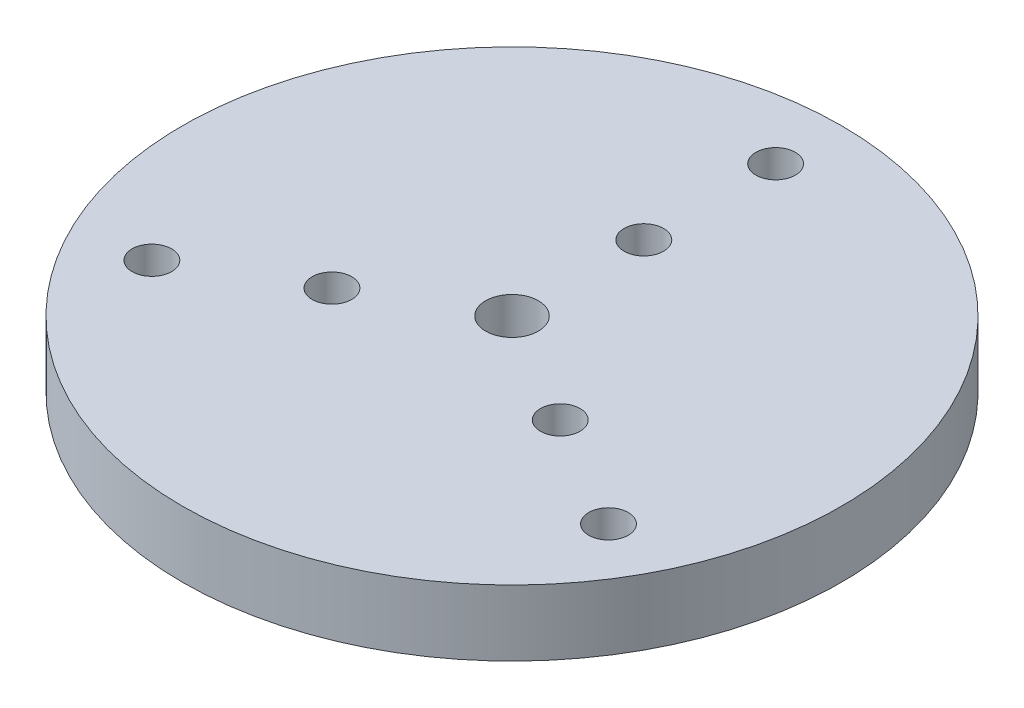
ISO-10303-21;
HEADER;
FILE_DESCRIPTION(('STEP AP214'),'2;1');
FILE_NAME('part.step','',(''),(''),'','','');
FILE_SCHEMA(('AUTOMOTIVE_DESIGN { 1 0 10303 214 1 1 1 1 }'));
ENDSEC;
DATA;
#1=APPLICATION_CONTEXT('core data for automotive mechanical design processes');
#2=APPLICATION_PROTOCOL_DEFINITION('international standard','automotive_design',2000,#1);
#3=PRODUCT_CONTEXT('',#1,'mechanical');
#4=PRODUCT('Part','Part','',(#3));
#5=PRODUCT_RELATED_PRODUCT_CATEGORY('part','',(#4));
#6=PRODUCT_DEFINITION_FORMATION('','',#4);
#7=PRODUCT_DEFINITION_CONTEXT('part definition',#1,'design');
#8=PRODUCT_DEFINITION('design','',#6,#7);
#9=PRODUCT_DEFINITION_SHAPE('','',#8);
#10=(LENGTH_UNIT() NAMED_UNIT(*) SI_UNIT(.MILLI.,.METRE.));
#11=(NAMED_UNIT(*) PLANE_ANGLE_UNIT() SI_UNIT($,.RADIAN.));
#12=(NAMED_UNIT(*) SI_UNIT($,.STERADIAN.) SOLID_ANGLE_UNIT());
#13=UNCERTAINTY_MEASURE_WITH_UNIT(LENGTH_MEASURE(1.E-05),#10,'distance_accuracy_value','');
#14=(GEOMETRIC_REPRESENTATION_CONTEXT(3) GLOBAL_UNCERTAINTY_ASSIGNED_CONTEXT((#13)) GLOBAL_UNIT_ASSIGNED_CONTEXT((#10,
#11,#12)) REPRESENTATION_CONTEXT('',''));
#15=CARTESIAN_POINT('',(0.,0.,0.));
#16=DIRECTION('',(0.,0.,1.));
#17=DIRECTION('',(1.,0.,0.));
#18=AXIS2_PLACEMENT_3D('',#15,#16,#17);
#19=CARTESIAN_POINT('',(0.,10.,0.));
#20=DIRECTION('',(0.,1.,0.));
#21=DIRECTION('',(0.,0.,1.));
#22=AXIS2_PLACEMENT_3D('',#19,#20,#21);
#23=PLANE('',#22);
#24=CARTESIAN_POINT('',(-34.6410161513746,10.,20.0000000000017));
#25=DIRECTION('',(0.,1.,0.));
#26=DIRECTION('',(0.,0.,1.));
#27=AXIS2_PLACEMENT_3D('',#24,#25,#26);
#28=CIRCLE('',#27,3.00000000000372);
#29=CARTESIAN_POINT('',(-34.6410161513746,10.,23.0000000000054));
#30=VERTEX_POINT('',#29);
#31=EDGE_CURVE('E71',#30,#30,#28,.T.);
#32=ORIENTED_EDGE('',*,*,#31,.F.);
#33=EDGE_LOOP('',(#32));
#34=FACE_BOUND('',#33,.T.);
#35=CARTESIAN_POINT('',(34.6410161513805,10.,19.9999999999983));
#36=DIRECTION('',(0.,1.,0.));
#37=DIRECTION('',(0.,0.,1.));
#38=AXIS2_PLACEMENT_3D('',#35,#36,#37);
#39=CIRCLE('',#38,3.00000000000253);
#40=CARTESIAN_POINT('',(34.6410161513805,10.,23.0000000000008));
#41=VERTEX_POINT('',#40);
#42=EDGE_CURVE('E59',#41,#41,#39,.T.);
#43=ORIENTED_EDGE('',*,*,#42,.F.);
#44=EDGE_LOOP('',(#43));
#45=FACE_BOUND('',#44,.T.);
#46=CARTESIAN_POINT('',(0.,10.,-40.));
#47=DIRECTION('',(0.,1.,0.));
#48=DIRECTION('',(0.,0.,1.));
#49=AXIS2_PLACEMENT_3D('',#46,#47,#48);
#50=CIRCLE('',#49,3.);
#51=CARTESIAN_POINT('',(0.,10.,-37.));
#52=VERTEX_POINT('',#51);
#53=EDGE_CURVE('E47',#52,#52,#50,.T.);
#54=ORIENTED_EDGE('',*,*,#53,.F.);
#55=EDGE_LOOP('',(#54));
#56=FACE_BOUND('',#55,.T.);
#57=CARTESIAN_POINT('',(0.,10.,0.));
#58=DIRECTION('',(0.,1.,0.));
#59=DIRECTION('',(0.,0.,1.));
#60=AXIS2_PLACEMENT_3D('',#57,#58,#59);
#61=CIRCLE('',#60,50.);
#62=CARTESIAN_POINT('',(0.,10.,50.));
#63=VERTEX_POINT('',#62);
#64=EDGE_CURVE('E10',#63,#63,#61,.T.);
#65=ORIENTED_EDGE('',*,*,#64,.T.);
#66=EDGE_LOOP('',(#65));
#67=FACE_BOUND('',#66,.T.);
#68=CARTESIAN_POINT('',(0.,10.,0.));
#69=DIRECTION('',(0.,1.,0.));
#70=DIRECTION('',(0.,0.,1.));
#71=AXIS2_PLACEMENT_3D('',#68,#69,#70);
#72=CIRCLE('',#71,4.);
#73=CARTESIAN_POINT('',(0.,10.,4.));
#74=VERTEX_POINT('',#73);
#75=EDGE_CURVE('E42',#74,#74,#72,.T.);
#76=ORIENTED_EDGE('',*,*,#75,.F.);
#77=EDGE_LOOP('',(#76));
#78=FACE_BOUND('',#77,.T.);
#79=CARTESIAN_POINT('',(0.,10.,-20.));
#80=DIRECTION('',(0.,1.,0.));
#81=DIRECTION('',(0.,0.,1.));
#82=AXIS2_PLACEMENT_3D('',#79,#80,#81);
#83=CIRCLE('',#82,3.);
#84=CARTESIAN_POINT('',(0.,10.,-17.));
#85=VERTEX_POINT('',#84);
#86=EDGE_CURVE('E53',#85,#85,#83,.T.);
#87=ORIENTED_EDGE('',*,*,#86,.F.);
#88=EDGE_LOOP('',(#87));
#89=FACE_BOUND('',#88,.T.);
#90=CARTESIAN_POINT('',(17.3205080756918,10.,9.99999999999828));
#91=DIRECTION('',(0.,1.,0.));
#92=DIRECTION('',(0.,0.,1.));
#93=AXIS2_PLACEMENT_3D('',#90,#91,#92);
#94=CIRCLE('',#93,3.00000000000244);
#95=CARTESIAN_POINT('',(17.3205080756918,10.,13.0000000000007));
#96=VERTEX_POINT('',#95);
#97=EDGE_CURVE('E65',#96,#96,#94,.T.);
#98=ORIENTED_EDGE('',*,*,#97,.F.);
#99=EDGE_LOOP('',(#98));
#100=FACE_BOUND('',#99,.T.);
#101=CARTESIAN_POINT('',(-17.3205080756858,10.,10.0000000000017));
#102=DIRECTION('',(0.,1.,0.));
#103=DIRECTION('',(0.,0.,1.));
#104=AXIS2_PLACEMENT_3D('',#101,#102,#103);
#105=CIRCLE('',#104,3.00000000000353);
#106=CARTESIAN_POINT('',(-17.3205080756858,10.,13.0000000000053));
#107=VERTEX_POINT('',#106);
#108=EDGE_CURVE('E77',#107,#107,#105,.T.);
#109=ORIENTED_EDGE('',*,*,#108,.F.);
#110=EDGE_LOOP('',(#109));
#111=FACE_BOUND('',#110,.T.);
#112=ADVANCED_FACE('F31',(#34,#45,#56,#67,#78,#89,#100,#111),#23,.T.);
#113=CARTESIAN_POINT('',(0.,0.,0.));
#114=DIRECTION('',(0.,1.,0.));
#115=DIRECTION('',(0.,0.,1.));
#116=AXIS2_PLACEMENT_3D('',#113,#114,#115);
#117=PLANE('',#116);
#118=CARTESIAN_POINT('',(0.,0.,0.));
#119=DIRECTION('',(0.,1.,0.));
#120=DIRECTION('',(0.,0.,1.));
#121=AXIS2_PLACEMENT_3D('',#118,#119,#120);
#122=CIRCLE('',#121,50.);
#123=CARTESIAN_POINT('',(0.,0.,50.));
#124=VERTEX_POINT('',#123);
#125=EDGE_CURVE('E35',#124,#124,#122,.T.);
#126=ORIENTED_EDGE('',*,*,#125,.F.);
#127=EDGE_LOOP('',(#126));
#128=FACE_BOUND('',#127,.T.);
#129=CARTESIAN_POINT('',(0.,0.,0.));
#130=DIRECTION('',(0.,1.,0.));
#131=DIRECTION('',(0.,0.,1.));
#132=AXIS2_PLACEMENT_3D('',#129,#130,#131);
#133=CIRCLE('',#132,4.);
#134=CARTESIAN_POINT('',(0.,0.,4.));
#135=VERTEX_POINT('',#134);
#136=EDGE_CURVE('E44',#135,#135,#133,.T.);
#137=ORIENTED_EDGE('',*,*,#136,.T.);
#138=EDGE_LOOP('',(#137));
#139=FACE_BOUND('',#138,.T.);
#140=CARTESIAN_POINT('',(0.,0.,-40.));
#141=DIRECTION('',(0.,1.,0.));
#142=DIRECTION('',(0.,0.,1.));
#143=AXIS2_PLACEMENT_3D('',#140,#141,#142);
#144=CIRCLE('',#143,3.);
#145=CARTESIAN_POINT('',(0.,0.,-37.));
#146=VERTEX_POINT('',#145);
#147=EDGE_CURVE('E50',#146,#146,#144,.T.);
#148=ORIENTED_EDGE('',*,*,#147,.T.);
#149=EDGE_LOOP('',(#148));
#150=FACE_BOUND('',#149,.T.);
#151=CARTESIAN_POINT('',(0.,0.,-20.));
#152=DIRECTION('',(0.,1.,0.));
#153=DIRECTION('',(0.,0.,1.));
#154=AXIS2_PLACEMENT_3D('',#151,#152,#153);
#155=CIRCLE('',#154,3.);
#156=CARTESIAN_POINT('',(0.,0.,-17.));
#157=VERTEX_POINT('',#156);
#158=EDGE_CURVE('E56',#157,#157,#155,.T.);
#159=ORIENTED_EDGE('',*,*,#158,.T.);
#160=EDGE_LOOP('',(#159));
#161=FACE_BOUND('',#160,.T.);
#162=CARTESIAN_POINT('',(34.6410161513805,0.,19.9999999999983));
#163=DIRECTION('',(0.,1.,0.));
#164=DIRECTION('',(0.,0.,1.));
#165=AXIS2_PLACEMENT_3D('',#162,#163,#164);
#166=CIRCLE('',#165,3.00000000000253);
#167=CARTESIAN_POINT('',(34.6410161513805,0.,23.0000000000008));
#168=VERTEX_POINT('',#167);
#169=EDGE_CURVE('E62',#168,#168,#166,.T.);
#170=ORIENTED_EDGE('',*,*,#169,.T.);
#171=EDGE_LOOP('',(#170));
#172=FACE_BOUND('',#171,.T.);
#173=CARTESIAN_POINT('',(17.3205080756918,0.,9.99999999999828));
#174=DIRECTION('',(0.,1.,0.));
#175=DIRECTION('',(0.,0.,1.));
#176=AXIS2_PLACEMENT_3D('',#173,#174,#175);
#177=CIRCLE('',#176,3.00000000000244);
#178=CARTESIAN_POINT('',(17.3205080756918,0.,13.0000000000007));
#179=VERTEX_POINT('',#178);
#180=EDGE_CURVE('E68',#179,#179,#177,.T.);
#181=ORIENTED_EDGE('',*,*,#180,.T.);
#182=EDGE_LOOP('',(#181));
#183=FACE_BOUND('',#182,.T.);
#184=CARTESIAN_POINT('',(-34.6410161513746,0.,20.0000000000017));
#185=DIRECTION('',(0.,1.,0.));
#186=DIRECTION('',(0.,0.,1.));
#187=AXIS2_PLACEMENT_3D('',#184,#185,#186);
#188=CIRCLE('',#187,3.00000000000372);
#189=CARTESIAN_POINT('',(-34.6410161513746,0.,23.0000000000054));
#190=VERTEX_POINT('',#189);
#191=EDGE_CURVE('E74',#190,#190,#188,.T.);
#192=ORIENTED_EDGE('',*,*,#191,.T.);
#193=EDGE_LOOP('',(#192));
#194=FACE_BOUND('',#193,.T.);
#195=CARTESIAN_POINT('',(-17.3205080756858,0.,10.0000000000017));
#196=DIRECTION('',(0.,1.,0.));
#197=DIRECTION('',(0.,0.,1.));
#198=AXIS2_PLACEMENT_3D('',#195,#196,#197);
#199=CIRCLE('',#198,3.00000000000353);
#200=CARTESIAN_POINT('',(-17.3205080756858,0.,13.0000000000053));
#201=VERTEX_POINT('',#200);
#202=EDGE_CURVE('E80',#201,#201,#199,.T.);
#203=ORIENTED_EDGE('',*,*,#202,.T.);
#204=EDGE_LOOP('',(#203));
#205=FACE_BOUND('',#204,.T.);
#206=ADVANCED_FACE('F90',(#128,#139,#150,#161,#172,#183,#194,#205),#117,.F.);
#207=CARTESIAN_POINT('',(0.,10.,0.));
#208=DIRECTION('',(0.,-1.,0.));
#209=DIRECTION('',(0.,0.,-1.));
#210=AXIS2_PLACEMENT_3D('',#207,#208,#209);
#211=CYLINDRICAL_SURFACE('',#210,50.);
#212=ORIENTED_EDGE('',*,*,#64,.F.);
#213=EDGE_LOOP('',(#212));
#214=FACE_BOUND('',#213,.T.);
#215=ORIENTED_EDGE('',*,*,#125,.T.);
#216=EDGE_LOOP('',(#215));
#217=FACE_BOUND('',#216,.T.);
#218=ADVANCED_FACE('F33',(#214,#217),#211,.T.);
#219=CARTESIAN_POINT('',(0.,10.,0.));
#220=DIRECTION('',(0.,-1.,0.));
#221=DIRECTION('',(0.,0.,-1.));
#222=AXIS2_PLACEMENT_3D('',#219,#220,#221);
#223=CYLINDRICAL_SURFACE('',#222,4.);
#224=ORIENTED_EDGE('',*,*,#75,.T.);
#225=EDGE_LOOP('',(#224));
#226=FACE_BOUND('',#225,.T.);
#227=ORIENTED_EDGE('',*,*,#136,.F.);
#228=EDGE_LOOP('',(#227));
#229=FACE_BOUND('',#228,.T.);
#230=ADVANCED_FACE('F100',(#226,#229),#223,.F.);
#231=CARTESIAN_POINT('',(0.,10.,-40.));
#232=DIRECTION('',(0.,-1.,0.));
#233=DIRECTION('',(0.,0.,-1.));
#234=AXIS2_PLACEMENT_3D('',#231,#232,#233);
#235=CYLINDRICAL_SURFACE('',#234,3.);
#236=ORIENTED_EDGE('',*,*,#53,.T.);
#237=EDGE_LOOP('',(#236));
#238=FACE_BOUND('',#237,.T.);
#239=ORIENTED_EDGE('',*,*,#147,.F.);
#240=EDGE_LOOP('',(#239));
#241=FACE_BOUND('',#240,.T.);
#242=ADVANCED_FACE('F103',(#238,#241),#235,.F.);
#243=CARTESIAN_POINT('',(0.,10.,-20.));
#244=DIRECTION('',(0.,-1.,0.));
#245=DIRECTION('',(0.,0.,-1.));
#246=AXIS2_PLACEMENT_3D('',#243,#244,#245);
#247=CYLINDRICAL_SURFACE('',#246,3.);
#248=ORIENTED_EDGE('',*,*,#86,.T.);
#249=EDGE_LOOP('',(#248));
#250=FACE_BOUND('',#249,.T.);
#251=ORIENTED_EDGE('',*,*,#158,.F.);
#252=EDGE_LOOP('',(#251));
#253=FACE_BOUND('',#252,.T.);
#254=ADVANCED_FACE('F107',(#250,#253),#247,.F.);
#255=CARTESIAN_POINT('',(34.6410161513805,10.,19.9999999999983));
#256=DIRECTION('',(0.,-1.,0.));
#257=DIRECTION('',(0.,0.,-1.));
#258=AXIS2_PLACEMENT_3D('',#255,#256,#257);
#259=CYLINDRICAL_SURFACE('',#258,3.00000000000253);
#260=ORIENTED_EDGE('',*,*,#42,.T.);
#261=EDGE_LOOP('',(#260));
#262=FACE_BOUND('',#261,.T.);
#263=ORIENTED_EDGE('',*,*,#169,.F.);
#264=EDGE_LOOP('',(#263));
#265=FACE_BOUND('',#264,.T.);
#266=ADVANCED_FACE('F111',(#262,#265),#259,.F.);
#267=CARTESIAN_POINT('',(17.3205080756918,10.,9.99999999999828));
#268=DIRECTION('',(0.,-1.,0.));
#269=DIRECTION('',(0.,0.,-1.));
#270=AXIS2_PLACEMENT_3D('',#267,#268,#269);
#271=CYLINDRICAL_SURFACE('',#270,3.00000000000244);
#272=ORIENTED_EDGE('',*,*,#97,.T.);
#273=EDGE_LOOP('',(#272));
#274=FACE_BOUND('',#273,.T.);
#275=ORIENTED_EDGE('',*,*,#180,.F.);
#276=EDGE_LOOP('',(#275));
#277=FACE_BOUND('',#276,.T.);
#278=ADVANCED_FACE('F115',(#274,#277),#271,.F.);
#279=CARTESIAN_POINT('',(-34.6410161513746,10.,20.0000000000017));
#280=DIRECTION('',(0.,-1.,0.));
#281=DIRECTION('',(0.,0.,-1.));
#282=AXIS2_PLACEMENT_3D('',#279,#280,#281);
#283=CYLINDRICAL_SURFACE('',#282,3.00000000000372);
#284=ORIENTED_EDGE('',*,*,#31,.T.);
#285=EDGE_LOOP('',(#284));
#286=FACE_BOUND('',#285,.T.);
#287=ORIENTED_EDGE('',*,*,#191,.F.);
#288=EDGE_LOOP('',(#287));
#289=FACE_BOUND('',#288,.T.);
#290=ADVANCED_FACE('F119',(#286,#289),#283,.F.);
#291=CARTESIAN_POINT('',(-17.3205080756858,10.,10.0000000000017));
#292=DIRECTION('',(0.,-1.,0.));
#293=DIRECTION('',(0.,0.,-1.));
#294=AXIS2_PLACEMENT_3D('',#291,#292,#293);
#295=CYLINDRICAL_SURFACE('',#294,3.00000000000353);
#296=ORIENTED_EDGE('',*,*,#108,.T.);
#297=EDGE_LOOP('',(#296));
#298=FACE_BOUND('',#297,.T.);
#299=ORIENTED_EDGE('',*,*,#202,.F.);
#300=EDGE_LOOP('',(#299));
#301=FACE_BOUND('',#300,.T.);
#302=ADVANCED_FACE('F86',(#298,#301),#295,.F.);
#303=CLOSED_SHELL('',(#112,#206,#218,#230,#242,#254,#266,#278,#290,#302));
#304=MANIFOLD_SOLID_BREP('B2',#303);
#305=ADVANCED_BREP_SHAPE_REPRESENTATION('',(#18,#304),#14);
#306=SHAPE_DEFINITION_REPRESENTATION(#9,#305);
ENDSEC;
END-ISO-10303-21;
